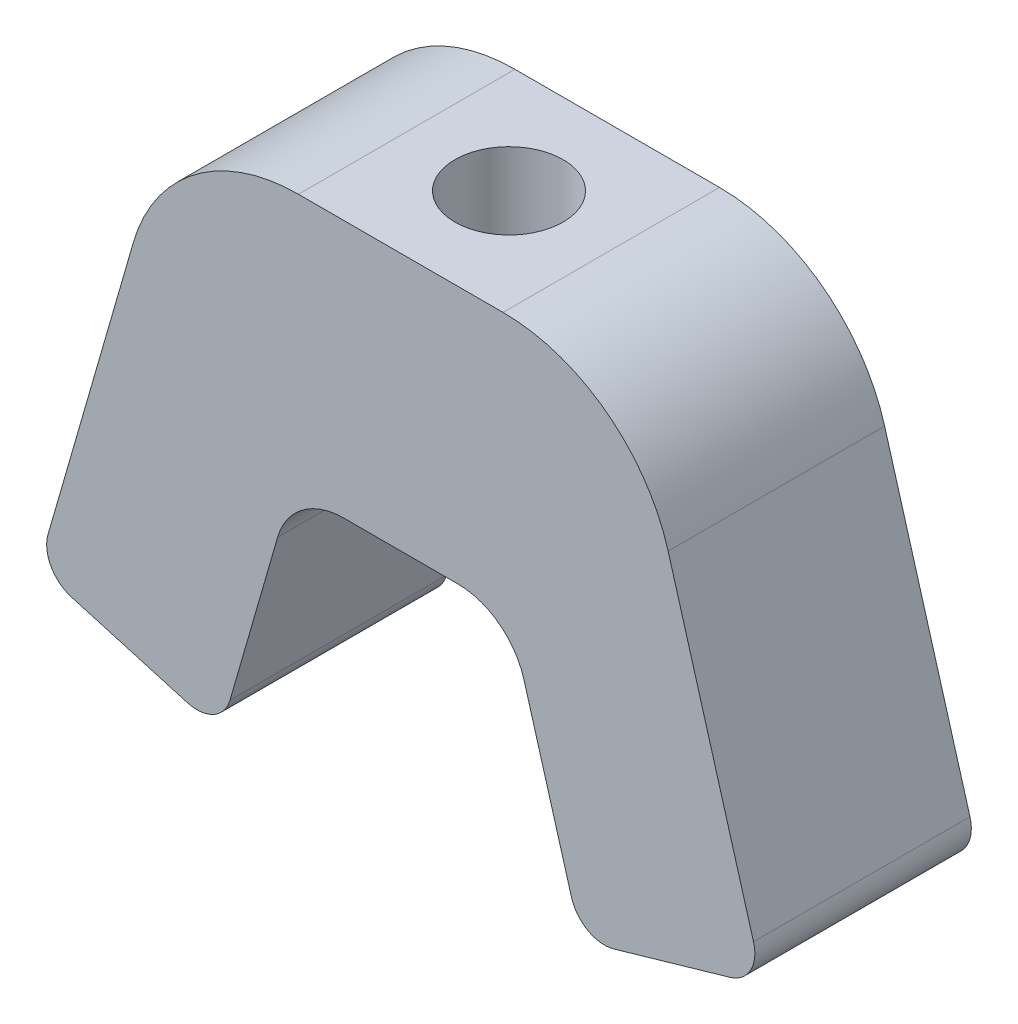
ISO-10303-21;
HEADER;
FILE_DESCRIPTION(('STEP AP214'),'2;1');
FILE_NAME('part.step','',(''),(''),'','','');
FILE_SCHEMA(('AUTOMOTIVE_DESIGN { 1 0 10303 214 1 1 1 1 }'));
ENDSEC;
DATA;
#1=APPLICATION_CONTEXT('core data for automotive mechanical design processes');
#2=APPLICATION_PROTOCOL_DEFINITION('international standard','automotive_design',2000,#1);
#3=PRODUCT_CONTEXT('',#1,'mechanical');
#4=PRODUCT('Part','Part','',(#3));
#5=PRODUCT_RELATED_PRODUCT_CATEGORY('part','',(#4));
#6=PRODUCT_DEFINITION_FORMATION('','',#4);
#7=PRODUCT_DEFINITION_CONTEXT('part definition',#1,'design');
#8=PRODUCT_DEFINITION('design','',#6,#7);
#9=PRODUCT_DEFINITION_SHAPE('','',#8);
#10=(LENGTH_UNIT() NAMED_UNIT(*) SI_UNIT(.MILLI.,.METRE.));
#11=(NAMED_UNIT(*) PLANE_ANGLE_UNIT() SI_UNIT($,.RADIAN.));
#12=(NAMED_UNIT(*) SI_UNIT($,.STERADIAN.) SOLID_ANGLE_UNIT());
#13=UNCERTAINTY_MEASURE_WITH_UNIT(LENGTH_MEASURE(1.E-05),#10,'distance_accuracy_value','');
#14=(GEOMETRIC_REPRESENTATION_CONTEXT(3) GLOBAL_UNCERTAINTY_ASSIGNED_CONTEXT((#13)) GLOBAL_UNIT_ASSIGNED_CONTEXT((#10,
#11,#12)) REPRESENTATION_CONTEXT('',''));
#15=CARTESIAN_POINT('',(0.,0.,0.));
#16=DIRECTION('',(0.,0.,1.));
#17=DIRECTION('',(1.,0.,0.));
#18=AXIS2_PLACEMENT_3D('',#15,#16,#17);
#19=CARTESIAN_POINT('',(-6.66246742722893,-35.6942294275561,8.));
#20=DIRECTION('',(-0.960758995019012,0.277384486750895,0.));
#21=DIRECTION('',(-0.277384486750895,-0.960758995019012,0.));
#22=AXIS2_PLACEMENT_3D('',#19,#20,#21);
#23=PLANE('',#22);
#24=DIRECTION('',(0.277384486750895,0.960758995019012,0.));
#25=VECTOR('',#24,1.);
#26=CARTESIAN_POINT('',(-6.66246742722893,-35.6942294275561,8.));
#27=LINE('',#26,#25);
#28=CARTESIAN_POINT('',(-6.31018912905529,-34.4740655038819,8.));
#29=VERTEX_POINT('',#28);
#30=CARTESIAN_POINT('',(-4.55029823397599,-28.3784434036527,8.));
#31=VERTEX_POINT('',#30);
#32=EDGE_CURVE('E200',#29,#31,#27,.T.);
#33=ORIENTED_EDGE('',*,*,#32,.F.);
#34=DIRECTION('',(0.,0.,-1.));
#35=VECTOR('',#34,1.);
#36=CARTESIAN_POINT('',(-6.31018912905529,-34.4740655038819,8.));
#37=LINE('',#36,#35);
#38=CARTESIAN_POINT('',(-6.31018912905529,-34.4740655038819,0.));
#39=VERTEX_POINT('',#38);
#40=EDGE_CURVE('E304',#29,#39,#37,.T.);
#41=ORIENTED_EDGE('',*,*,#40,.T.);
#42=DIRECTION('',(0.277384486750895,0.960758995019012,0.));
#43=VECTOR('',#42,1.);
#44=CARTESIAN_POINT('',(-6.66246742722893,-35.6942294275561,0.));
#45=LINE('',#44,#43);
#46=CARTESIAN_POINT('',(-4.55029823397599,-28.3784434036527,0.));
#47=VERTEX_POINT('',#46);
#48=EDGE_CURVE('E199',#39,#47,#45,.T.);
#49=ORIENTED_EDGE('',*,*,#48,.T.);
#50=DIRECTION('',(0.,0.,-1.));
#51=VECTOR('',#50,1.);
#52=CARTESIAN_POINT('',(-4.55029823397599,-28.3784434036527,8.));
#53=LINE('',#52,#51);
#54=EDGE_CURVE('E268',#47,#31,#53,.F.);
#55=ORIENTED_EDGE('',*,*,#54,.T.);
#56=EDGE_LOOP('',(#33,#41,#49,#55));
#57=FACE_BOUND('',#56,.T.);
#58=ADVANCED_FACE('F53',(#57),#23,.F.);
#59=CARTESIAN_POINT('',(-4.02038019092665,-26.543,8.));
#60=DIRECTION('',(0.,1.,0.));
#61=DIRECTION('',(0.,0.,1.));
#62=AXIS2_PLACEMENT_3D('',#59,#60,#61);
#63=PLANE('',#62);
#64=CARTESIAN_POINT('',(0.,-26.543,4.));
#65=DIRECTION('',(0.,1.,0.));
#66=DIRECTION('',(0.,0.,1.));
#67=AXIS2_PLACEMENT_3D('',#64,#65,#66);
#68=CIRCLE('',#67,2.);
#69=CARTESIAN_POINT('',(0.,-26.543,6.));
#70=VERTEX_POINT('',#69);
#71=EDGE_CURVE('E196',#70,#70,#68,.T.);
#72=ORIENTED_EDGE('',*,*,#71,.T.);
#73=EDGE_LOOP('',(#72));
#74=FACE_BOUND('',#73,.T.);
#75=DIRECTION('',(1.,0.,0.));
#76=VECTOR('',#75,1.);
#77=CARTESIAN_POINT('',(-4.02038019092665,-26.543,0.));
#78=LINE('',#77,#76);
#79=CARTESIAN_POINT('',(-2.1099703866277,-26.543,0.));
#80=VERTEX_POINT('',#79);
#81=CARTESIAN_POINT('',(2.10997038662771,-26.543,0.));
#82=VERTEX_POINT('',#81);
#83=EDGE_CURVE('E223',#80,#82,#78,.T.);
#84=ORIENTED_EDGE('',*,*,#83,.T.);
#85=DIRECTION('',(0.,0.,-1.));
#86=VECTOR('',#85,1.);
#87=CARTESIAN_POINT('',(2.10997038662771,-26.543,8.));
#88=LINE('',#87,#86);
#89=CARTESIAN_POINT('',(2.10997038662771,-26.543,8.));
#90=VERTEX_POINT('',#89);
#91=EDGE_CURVE('E266',#82,#90,#88,.F.);
#92=ORIENTED_EDGE('',*,*,#91,.T.);
#93=DIRECTION('',(1.,0.,0.));
#94=VECTOR('',#93,1.);
#95=CARTESIAN_POINT('',(-4.02038019092665,-26.543,8.));
#96=LINE('',#95,#94);
#97=CARTESIAN_POINT('',(-2.1099703866277,-26.543,8.));
#98=VERTEX_POINT('',#97);
#99=EDGE_CURVE('E202',#98,#90,#96,.T.);
#100=ORIENTED_EDGE('',*,*,#99,.F.);
#101=DIRECTION('',(0.,0.,-1.));
#102=VECTOR('',#101,1.);
#103=CARTESIAN_POINT('',(-2.1099703866277,-26.543,0.));
#104=LINE('',#103,#102);
#105=EDGE_CURVE('E263',#98,#80,#104,.T.);
#106=ORIENTED_EDGE('',*,*,#105,.T.);
#107=EDGE_LOOP('',(#84,#92,#100,#106));
#108=FACE_BOUND('',#107,.T.);
#109=ADVANCED_FACE('F334',(#74,#108),#63,.F.);
#110=CARTESIAN_POINT('',(4.02038019092666,-26.543,8.));
#111=DIRECTION('',(0.960758995019012,0.277384486750896,0.));
#112=DIRECTION('',(-0.277384486750896,0.960758995019012,0.));
#113=AXIS2_PLACEMENT_3D('',#110,#111,#112);
#114=PLANE('',#113);
#115=DIRECTION('',(0.277384486750896,-0.960758995019012,0.));
#116=VECTOR('',#115,1.);
#117=CARTESIAN_POINT('',(4.02038019092666,-26.543,0.));
#118=LINE('',#117,#116);
#119=CARTESIAN_POINT('',(4.550298233976,-28.3784434036527,0.));
#120=VERTEX_POINT('',#119);
#121=CARTESIAN_POINT('',(6.3101891290553,-34.4740655038819,0.));
#122=VERTEX_POINT('',#121);
#123=EDGE_CURVE('E226',#120,#122,#118,.T.);
#124=ORIENTED_EDGE('',*,*,#123,.T.);
#125=DIRECTION('',(0.,0.,-1.));
#126=VECTOR('',#125,1.);
#127=CARTESIAN_POINT('',(6.3101891290553,-34.4740655038819,8.));
#128=LINE('',#127,#126);
#129=CARTESIAN_POINT('',(6.3101891290553,-34.4740655038819,8.));
#130=VERTEX_POINT('',#129);
#131=EDGE_CURVE('E68',#122,#130,#128,.F.);
#132=ORIENTED_EDGE('',*,*,#131,.T.);
#133=DIRECTION('',(0.277384486750896,-0.960758995019012,0.));
#134=VECTOR('',#133,1.);
#135=CARTESIAN_POINT('',(4.02038019092666,-26.543,8.));
#136=LINE('',#135,#134);
#137=CARTESIAN_POINT('',(4.550298233976,-28.3784434036527,8.));
#138=VERTEX_POINT('',#137);
#139=EDGE_CURVE('E206',#138,#130,#136,.T.);
#140=ORIENTED_EDGE('',*,*,#139,.F.);
#141=DIRECTION('',(0.,0.,-1.));
#142=VECTOR('',#141,1.);
#143=CARTESIAN_POINT('',(4.550298233976,-28.3784434036527,0.));
#144=LINE('',#143,#142);
#145=EDGE_CURVE('E260',#138,#120,#144,.T.);
#146=ORIENTED_EDGE('',*,*,#145,.T.);
#147=EDGE_LOOP('',(#124,#132,#140,#146));
#148=FACE_BOUND('',#147,.T.);
#149=ADVANCED_FACE('F340',(#148),#114,.F.);
#150=CARTESIAN_POINT('',(6.66246742722894,-35.6942294275561,8.));
#151=DIRECTION('',(-0.277384486750897,0.960758995019012,0.));
#152=DIRECTION('',(-0.960758995019012,-0.277384486750897,0.));
#153=AXIS2_PLACEMENT_3D('',#150,#151,#152);
#154=PLANE('',#153);
#155=CARTESIAN_POINT('',(10.0251239097955,-34.723383723928,4.));
#156=DIRECTION('',(0.277384486750897,-0.960758995019012,0.));
#157=DIRECTION('',(0.960758995019012,0.277384486750897,0.));
#158=AXIS2_PLACEMENT_3D('',#155,#156,#157);
#159=CIRCLE('',#158,2.);
#160=CARTESIAN_POINT('',(11.9466418998335,-34.1686147504262,4.));
#161=VERTEX_POINT('',#160);
#162=EDGE_CURVE('E182',#161,#161,#159,.T.);
#163=ORIENTED_EDGE('',*,*,#162,.F.);
#164=EDGE_LOOP('',(#163));
#165=FACE_BOUND('',#164,.T.);
#166=DIRECTION('',(0.960758995019012,0.277384486750897,0.));
#167=VECTOR('',#166,1.);
#168=CARTESIAN_POINT('',(6.66246742722894,-35.6942294275561,0.));
#169=LINE('',#168,#167);
#170=CARTESIAN_POINT('',(7.88263135090309,-35.3419511293825,0.));
#171=VERTEX_POINT('',#170);
#172=CARTESIAN_POINT('',(12.1676164686879,-34.1048163184735,0.));
#173=VERTEX_POINT('',#172);
#174=EDGE_CURVE('E228',#171,#173,#169,.T.);
#175=ORIENTED_EDGE('',*,*,#174,.T.);
#176=DIRECTION('',(0.,0.,-1.));
#177=VECTOR('',#176,1.);
#178=CARTESIAN_POINT('',(12.1676164686879,-34.1048163184735,8.));
#179=LINE('',#178,#177);
#180=CARTESIAN_POINT('',(12.1676164686879,-34.1048163184735,8.));
#181=VERTEX_POINT('',#180);
#182=EDGE_CURVE('E294',#173,#181,#179,.F.);
#183=ORIENTED_EDGE('',*,*,#182,.T.);
#184=DIRECTION('',(0.960758995019012,0.277384486750897,0.));
#185=VECTOR('',#184,1.);
#186=CARTESIAN_POINT('',(6.66246742722894,-35.6942294275561,8.));
#187=LINE('',#186,#185);
#188=CARTESIAN_POINT('',(7.88263135090309,-35.3419511293825,8.));
#189=VERTEX_POINT('',#188);
#190=EDGE_CURVE('E208',#189,#181,#187,.T.);
#191=ORIENTED_EDGE('',*,*,#190,.F.);
#192=DIRECTION('',(0.,0.,-1.));
#193=VECTOR('',#192,1.);
#194=CARTESIAN_POINT('',(7.88263135090309,-35.3419511293825,8.));
#195=LINE('',#194,#193);
#196=EDGE_CURVE('E291',#189,#171,#195,.T.);
#197=ORIENTED_EDGE('',*,*,#196,.T.);
#198=EDGE_LOOP('',(#175,#183,#191,#197));
#199=FACE_BOUND('',#198,.T.);
#200=ADVANCED_FACE('F348',(#165,#199),#154,.F.);
#201=CARTESIAN_POINT('',(13.387780392362,-33.7525380202998,8.));
#202=DIRECTION('',(-0.960758995019012,-0.277384486750896,0.));
#203=DIRECTION('',(0.277384486750896,-0.960758995019012,0.));
#204=AXIS2_PLACEMENT_3D('',#201,#202,#203);
#205=PLANE('',#204);
#206=DIRECTION('',(-0.277384486750896,0.960758995019012,0.));
#207=VECTOR('',#206,1.);
#208=CARTESIAN_POINT('',(13.387780392362,-33.7525380202998,8.));
#209=LINE('',#208,#207);
#210=CARTESIAN_POINT('',(13.0355020941884,-32.5323740966257,8.));
#211=VERTEX_POINT('',#210);
#212=CARTESIAN_POINT('',(9.88108158336339,-21.6066085091318,8.));
#213=VERTEX_POINT('',#212);
#214=EDGE_CURVE('E211',#211,#213,#209,.T.);
#215=ORIENTED_EDGE('',*,*,#214,.F.);
#216=DIRECTION('',(0.,0.,-1.));
#217=VECTOR('',#216,1.);
#218=CARTESIAN_POINT('',(13.0355020941884,-32.5323740966257,8.));
#219=LINE('',#218,#217);
#220=CARTESIAN_POINT('',(13.0355020941884,-32.5323740966257,0.));
#221=VERTEX_POINT('',#220);
#222=EDGE_CURVE('E280',#211,#221,#219,.T.);
#223=ORIENTED_EDGE('',*,*,#222,.T.);
#224=DIRECTION('',(-0.277384486750896,0.960758995019012,0.));
#225=VECTOR('',#224,1.);
#226=CARTESIAN_POINT('',(13.387780392362,-33.7525380202998,0.));
#227=LINE('',#226,#225);
#228=CARTESIAN_POINT('',(9.88108158336339,-21.6066085091318,0.));
#229=VERTEX_POINT('',#228);
#230=EDGE_CURVE('E231',#221,#229,#227,.T.);
#231=ORIENTED_EDGE('',*,*,#230,.T.);
#232=DIRECTION('',(0.,0.,-1.));
#233=VECTOR('',#232,1.);
#234=CARTESIAN_POINT('',(9.88108158336339,-21.6066085091318,8.));
#235=LINE('',#234,#233);
#236=EDGE_CURVE('E257',#229,#213,#235,.F.);
#237=ORIENTED_EDGE('',*,*,#236,.T.);
#238=EDGE_LOOP('',(#215,#223,#231,#237));
#239=FACE_BOUND('',#238,.T.);
#240=ADVANCED_FACE('F356',(#239),#205,.F.);
#241=CARTESIAN_POINT('',(8.55628647574003,-17.018,8.));
#242=DIRECTION('',(0.,-1.,0.));
#243=DIRECTION('',(1.,0.,0.));
#244=AXIS2_PLACEMENT_3D('',#241,#242,#243);
#245=PLANE('',#244);
#246=CARTESIAN_POINT('',(0.,-17.018,4.));
#247=DIRECTION('',(0.,1.,0.));
#248=DIRECTION('',(0.,0.,1.));
#249=AXIS2_PLACEMENT_3D('',#246,#247,#248);
#250=CIRCLE('',#249,2.);
#251=CARTESIAN_POINT('',(0.,-17.018,6.));
#252=VERTEX_POINT('',#251);
#253=EDGE_CURVE('E193',#252,#252,#250,.T.);
#254=ORIENTED_EDGE('',*,*,#253,.F.);
#255=EDGE_LOOP('',(#254));
#256=FACE_BOUND('',#255,.T.);
#257=DIRECTION('',(-1.,0.,0.));
#258=VECTOR('',#257,1.);
#259=CARTESIAN_POINT('',(8.55628647574003,-17.018,0.));
#260=LINE('',#259,#258);
#261=CARTESIAN_POINT('',(3.78026196499266,-17.018,0.));
#262=VERTEX_POINT('',#261);
#263=CARTESIAN_POINT('',(-3.78026196499265,-17.018,0.));
#264=VERTEX_POINT('',#263);
#265=EDGE_CURVE('E233',#262,#264,#260,.T.);
#266=ORIENTED_EDGE('',*,*,#265,.T.);
#267=DIRECTION('',(0.,0.,-1.));
#268=VECTOR('',#267,1.);
#269=CARTESIAN_POINT('',(-3.78026196499265,-17.018,8.));
#270=LINE('',#269,#268);
#271=CARTESIAN_POINT('',(-3.78026196499265,-17.018,8.));
#272=VERTEX_POINT('',#271);
#273=EDGE_CURVE('E251',#264,#272,#270,.F.);
#274=ORIENTED_EDGE('',*,*,#273,.T.);
#275=DIRECTION('',(-1.,0.,0.));
#276=VECTOR('',#275,1.);
#277=CARTESIAN_POINT('',(8.55628647574003,-17.018,8.));
#278=LINE('',#277,#276);
#279=CARTESIAN_POINT('',(3.78026196499266,-17.018,8.));
#280=VERTEX_POINT('',#279);
#281=EDGE_CURVE('E213',#280,#272,#278,.T.);
#282=ORIENTED_EDGE('',*,*,#281,.F.);
#283=DIRECTION('',(0.,0.,-1.));
#284=VECTOR('',#283,1.);
#285=CARTESIAN_POINT('',(3.78026196499266,-17.018,8.));
#286=LINE('',#285,#284);
#287=EDGE_CURVE('E248',#280,#262,#286,.T.);
#288=ORIENTED_EDGE('',*,*,#287,.T.);
#289=EDGE_LOOP('',(#266,#274,#282,#288));
#290=FACE_BOUND('',#289,.T.);
#291=ADVANCED_FACE('F366',(#256,#290),#245,.F.);
#292=CARTESIAN_POINT('',(-8.55628647574002,-17.018,8.));
#293=DIRECTION('',(0.960758995019012,-0.277384486750896,0.));
#294=DIRECTION('',(0.277384486750896,0.960758995019012,0.));
#295=AXIS2_PLACEMENT_3D('',#292,#293,#294);
#296=PLANE('',#295);
#297=DIRECTION('',(-0.277384486750896,-0.960758995019012,0.));
#298=VECTOR('',#297,1.);
#299=CARTESIAN_POINT('',(-8.55628647574002,-17.018,0.));
#300=LINE('',#299,#298);
#301=CARTESIAN_POINT('',(-9.88108158336338,-21.6066085091318,0.));
#302=VERTEX_POINT('',#301);
#303=CARTESIAN_POINT('',(-13.0355020941884,-32.5323740966257,0.));
#304=VERTEX_POINT('',#303);
#305=EDGE_CURVE('E236',#302,#304,#300,.T.);
#306=ORIENTED_EDGE('',*,*,#305,.T.);
#307=DIRECTION('',(0.,0.,-1.));
#308=VECTOR('',#307,1.);
#309=CARTESIAN_POINT('',(-13.0355020941884,-32.5323740966257,8.));
#310=LINE('',#309,#308);
#311=CARTESIAN_POINT('',(-13.0355020941884,-32.5323740966257,8.));
#312=VERTEX_POINT('',#311);
#313=EDGE_CURVE('E11',#304,#312,#310,.F.);
#314=ORIENTED_EDGE('',*,*,#313,.T.);
#315=DIRECTION('',(-0.277384486750896,-0.960758995019012,0.));
#316=VECTOR('',#315,1.);
#317=CARTESIAN_POINT('',(-8.55628647574002,-17.018,8.));
#318=LINE('',#317,#316);
#319=CARTESIAN_POINT('',(-9.88108158336338,-21.6066085091318,8.));
#320=VERTEX_POINT('',#319);
#321=EDGE_CURVE('E216',#320,#312,#318,.T.);
#322=ORIENTED_EDGE('',*,*,#321,.F.);
#323=DIRECTION('',(0.,0.,-1.));
#324=VECTOR('',#323,1.);
#325=CARTESIAN_POINT('',(-9.88108158336338,-21.6066085091318,8.));
#326=LINE('',#325,#324);
#327=EDGE_CURVE('E221',#320,#302,#326,.T.);
#328=ORIENTED_EDGE('',*,*,#327,.T.);
#329=EDGE_LOOP('',(#306,#314,#322,#328));
#330=FACE_BOUND('',#329,.T.);
#331=ADVANCED_FACE('F373',(#330),#296,.F.);
#332=CARTESIAN_POINT('',(-13.387780392362,-33.7525380202998,8.));
#333=DIRECTION('',(0.277384486750896,0.960758995019012,0.));
#334=DIRECTION('',(-0.960758995019012,0.277384486750896,0.));
#335=AXIS2_PLACEMENT_3D('',#332,#333,#334);
#336=PLANE('',#335);
#337=CARTESIAN_POINT('',(-10.0251239097955,-34.723383723928,4.));
#338=DIRECTION('',(-0.277384486750896,-0.960758995019012,0.));
#339=DIRECTION('',(0.960758995019012,-0.277384486750896,0.));
#340=AXIS2_PLACEMENT_3D('',#337,#338,#339);
#341=CIRCLE('',#340,2.);
#342=CARTESIAN_POINT('',(-8.10360591975745,-35.2781526974298,4.));
#343=VERTEX_POINT('',#342);
#344=EDGE_CURVE('E183',#343,#343,#341,.T.);
#345=ORIENTED_EDGE('',*,*,#344,.F.);
#346=EDGE_LOOP('',(#345));
#347=FACE_BOUND('',#346,.T.);
#348=DIRECTION('',(0.960758995019012,-0.277384486750896,0.));
#349=VECTOR('',#348,1.);
#350=CARTESIAN_POINT('',(-13.387780392362,-33.7525380202998,0.));
#351=LINE('',#350,#349);
#352=CARTESIAN_POINT('',(-12.1676164686879,-34.1048163184735,0.));
#353=VERTEX_POINT('',#352);
#354=CARTESIAN_POINT('',(-7.88263135090307,-35.3419511293825,0.));
#355=VERTEX_POINT('',#354);
#356=EDGE_CURVE('E203',#353,#355,#351,.T.);
#357=ORIENTED_EDGE('',*,*,#356,.T.);
#358=DIRECTION('',(0.,0.,-1.));
#359=VECTOR('',#358,1.);
#360=CARTESIAN_POINT('',(-7.88263135090307,-35.3419511293825,8.));
#361=LINE('',#360,#359);
#362=CARTESIAN_POINT('',(-7.88263135090307,-35.3419511293825,8.));
#363=VERTEX_POINT('',#362);
#364=EDGE_CURVE('E61',#355,#363,#361,.F.);
#365=ORIENTED_EDGE('',*,*,#364,.T.);
#366=DIRECTION('',(0.960758995019012,-0.277384486750896,0.));
#367=VECTOR('',#366,1.);
#368=CARTESIAN_POINT('',(-13.387780392362,-33.7525380202998,8.));
#369=LINE('',#368,#367);
#370=CARTESIAN_POINT('',(-12.1676164686879,-34.1048163184735,8.));
#371=VERTEX_POINT('',#370);
#372=EDGE_CURVE('E219',#371,#363,#369,.T.);
#373=ORIENTED_EDGE('',*,*,#372,.F.);
#374=DIRECTION('',(0.,0.,-1.));
#375=VECTOR('',#374,1.);
#376=CARTESIAN_POINT('',(-12.1676164686879,-34.1048163184735,8.));
#377=LINE('',#376,#375);
#378=EDGE_CURVE('E307',#371,#353,#377,.T.);
#379=ORIENTED_EDGE('',*,*,#378,.T.);
#380=EDGE_LOOP('',(#357,#365,#373,#379));
#381=FACE_BOUND('',#380,.T.);
#382=ADVANCED_FACE('F312',(#347,#381),#336,.F.);
#383=CARTESIAN_POINT('',(0.,0.,8.));
#384=DIRECTION('',(0.,0.,-1.));
#385=DIRECTION('',(-1.,0.,0.));
#386=AXIS2_PLACEMENT_3D('',#383,#384,#385);
#387=PLANE('',#386);
#388=ORIENTED_EDGE('',*,*,#190,.T.);
#389=CARTESIAN_POINT('',(11.8153381705142,-32.8846523947993,8.));
#390=DIRECTION('',(0.,0.,-1.));
#391=DIRECTION('',(-1.,0.,0.));
#392=AXIS2_PLACEMENT_3D('',#389,#390,#391);
#393=CIRCLE('',#392,1.27);
#394=EDGE_CURVE('E301',#181,#211,#393,.F.);
#395=ORIENTED_EDGE('',*,*,#394,.T.);
#396=ORIENTED_EDGE('',*,*,#214,.T.);
#397=CARTESIAN_POINT('',(3.78026196499266,-23.368,8.));
#398=DIRECTION('',(0.,0.,-1.));
#399=DIRECTION('',(-1.,0.,0.));
#400=AXIS2_PLACEMENT_3D('',#397,#398,#399);
#401=CIRCLE('',#400,6.35);
#402=EDGE_CURVE('E253',#213,#280,#401,.F.);
#403=ORIENTED_EDGE('',*,*,#402,.T.);
#404=ORIENTED_EDGE('',*,*,#281,.T.);
#405=CARTESIAN_POINT('',(-3.78026196499265,-23.368,8.));
#406=DIRECTION('',(0.,0.,-1.));
#407=DIRECTION('',(-1.,0.,0.));
#408=AXIS2_PLACEMENT_3D('',#405,#406,#407);
#409=CIRCLE('',#408,6.35);
#410=EDGE_CURVE('E255',#272,#320,#409,.F.);
#411=ORIENTED_EDGE('',*,*,#410,.T.);
#412=ORIENTED_EDGE('',*,*,#321,.T.);
#413=CARTESIAN_POINT('',(-11.8153381705142,-32.8846523947993,8.));
#414=DIRECTION('',(0.,0.,-1.));
#415=DIRECTION('',(-1.,0.,0.));
#416=AXIS2_PLACEMENT_3D('',#413,#414,#415);
#417=CIRCLE('',#416,1.27);
#418=EDGE_CURVE('E296',#312,#371,#417,.F.);
#419=ORIENTED_EDGE('',*,*,#418,.T.);
#420=ORIENTED_EDGE('',*,*,#372,.T.);
#421=CARTESIAN_POINT('',(-7.53035305272943,-34.1217872057083,8.));
#422=DIRECTION('',(0.,0.,-1.));
#423=DIRECTION('',(-1.,0.,0.));
#424=AXIS2_PLACEMENT_3D('',#421,#422,#423);
#425=CIRCLE('',#424,1.27);
#426=EDGE_CURVE('E76',#363,#29,#425,.F.);
#427=ORIENTED_EDGE('',*,*,#426,.T.);
#428=ORIENTED_EDGE('',*,*,#32,.T.);
#429=CARTESIAN_POINT('',(-2.1099703866277,-29.083,8.));
#430=DIRECTION('',(0.,0.,-1.));
#431=DIRECTION('',(-1.,0.,0.));
#432=AXIS2_PLACEMENT_3D('',#429,#430,#431);
#433=CIRCLE('',#432,2.54);
#434=EDGE_CURVE('E278',#31,#98,#433,.T.);
#435=ORIENTED_EDGE('',*,*,#434,.T.);
#436=ORIENTED_EDGE('',*,*,#99,.T.);
#437=CARTESIAN_POINT('',(2.10997038662771,-29.083,8.));
#438=DIRECTION('',(0.,0.,-1.));
#439=DIRECTION('',(-1.,0.,0.));
#440=AXIS2_PLACEMENT_3D('',#437,#438,#439);
#441=CIRCLE('',#440,2.54);
#442=EDGE_CURVE('E273',#90,#138,#441,.T.);
#443=ORIENTED_EDGE('',*,*,#442,.T.);
#444=ORIENTED_EDGE('',*,*,#139,.T.);
#445=CARTESIAN_POINT('',(7.53035305272945,-34.1217872057083,8.));
#446=DIRECTION('',(0.,0.,-1.));
#447=DIRECTION('',(-1.,0.,0.));
#448=AXIS2_PLACEMENT_3D('',#445,#446,#447);
#449=CIRCLE('',#448,1.27);
#450=EDGE_CURVE('E299',#130,#189,#449,.F.);
#451=ORIENTED_EDGE('',*,*,#450,.T.);
#452=EDGE_LOOP('',(#388,#395,#396,#403,#404,#411,#412,#419,#420,#427,#428,#435,#436,#443,#444,#451));
#453=FACE_BOUND('',#452,.T.);
#454=ADVANCED_FACE('F316',(#453),#387,.F.);
#455=CARTESIAN_POINT('',(0.,0.,0.));
#456=DIRECTION('',(0.,0.,-1.));
#457=DIRECTION('',(-1.,0.,0.));
#458=AXIS2_PLACEMENT_3D('',#455,#456,#457);
#459=PLANE('',#458);
#460=ORIENTED_EDGE('',*,*,#230,.F.);
#461=CARTESIAN_POINT('',(11.8153381705142,-32.8846523947993,0.));
#462=DIRECTION('',(0.,0.,-1.));
#463=DIRECTION('',(-1.,0.,0.));
#464=AXIS2_PLACEMENT_3D('',#461,#462,#463);
#465=CIRCLE('',#464,1.27);
#466=EDGE_CURVE('E289',#221,#173,#465,.T.);
#467=ORIENTED_EDGE('',*,*,#466,.T.);
#468=ORIENTED_EDGE('',*,*,#174,.F.);
#469=CARTESIAN_POINT('',(7.53035305272945,-34.1217872057083,0.));
#470=DIRECTION('',(0.,0.,-1.));
#471=DIRECTION('',(-1.,0.,0.));
#472=AXIS2_PLACEMENT_3D('',#469,#470,#471);
#473=CIRCLE('',#472,1.27);
#474=EDGE_CURVE('E287',#171,#122,#473,.T.);
#475=ORIENTED_EDGE('',*,*,#474,.T.);
#476=ORIENTED_EDGE('',*,*,#123,.F.);
#477=CARTESIAN_POINT('',(2.10997038662771,-29.083,0.));
#478=DIRECTION('',(0.,0.,-1.));
#479=DIRECTION('',(-1.,0.,0.));
#480=AXIS2_PLACEMENT_3D('',#477,#478,#479);
#481=CIRCLE('',#480,2.54);
#482=EDGE_CURVE('E271',#120,#82,#481,.F.);
#483=ORIENTED_EDGE('',*,*,#482,.T.);
#484=ORIENTED_EDGE('',*,*,#83,.F.);
#485=CARTESIAN_POINT('',(-2.1099703866277,-29.083,0.));
#486=DIRECTION('',(0.,0.,-1.));
#487=DIRECTION('',(-1.,0.,0.));
#488=AXIS2_PLACEMENT_3D('',#485,#486,#487);
#489=CIRCLE('',#488,2.54);
#490=EDGE_CURVE('E275',#80,#47,#489,.F.);
#491=ORIENTED_EDGE('',*,*,#490,.T.);
#492=ORIENTED_EDGE('',*,*,#48,.F.);
#493=CARTESIAN_POINT('',(-7.53035305272943,-34.1217872057083,0.));
#494=DIRECTION('',(0.,0.,-1.));
#495=DIRECTION('',(-1.,0.,0.));
#496=AXIS2_PLACEMENT_3D('',#493,#494,#495);
#497=CIRCLE('',#496,1.27);
#498=EDGE_CURVE('E285',#39,#355,#497,.T.);
#499=ORIENTED_EDGE('',*,*,#498,.T.);
#500=ORIENTED_EDGE('',*,*,#356,.F.);
#501=CARTESIAN_POINT('',(-11.8153381705142,-32.8846523947993,0.));
#502=DIRECTION('',(0.,0.,-1.));
#503=DIRECTION('',(-1.,0.,0.));
#504=AXIS2_PLACEMENT_3D('',#501,#502,#503);
#505=CIRCLE('',#504,1.27);
#506=EDGE_CURVE('E283',#353,#304,#505,.T.);
#507=ORIENTED_EDGE('',*,*,#506,.T.);
#508=ORIENTED_EDGE('',*,*,#305,.F.);
#509=CARTESIAN_POINT('',(-3.78026196499265,-23.368,0.));
#510=DIRECTION('',(0.,0.,-1.));
#511=DIRECTION('',(-1.,0.,0.));
#512=AXIS2_PLACEMENT_3D('',#509,#510,#511);
#513=CIRCLE('',#512,6.35);
#514=EDGE_CURVE('E246',#302,#264,#513,.T.);
#515=ORIENTED_EDGE('',*,*,#514,.T.);
#516=ORIENTED_EDGE('',*,*,#265,.F.);
#517=CARTESIAN_POINT('',(3.78026196499266,-23.368,0.));
#518=DIRECTION('',(0.,0.,-1.));
#519=DIRECTION('',(-1.,0.,0.));
#520=AXIS2_PLACEMENT_3D('',#517,#518,#519);
#521=CIRCLE('',#520,6.35);
#522=EDGE_CURVE('E243',#262,#229,#521,.T.);
#523=ORIENTED_EDGE('',*,*,#522,.T.);
#524=EDGE_LOOP('',(#460,#467,#468,#475,#476,#483,#484,#491,#492,#499,#500,#507,#508,#515,#516,#523));
#525=FACE_BOUND('',#524,.T.);
#526=ADVANCED_FACE('F324',(#525),#459,.T.);
#527=CARTESIAN_POINT('',(-3.78026196499265,-23.368,8.));
#528=DIRECTION('',(0.,0.,-1.));
#529=DIRECTION('',(-1.,0.,0.));
#530=AXIS2_PLACEMENT_3D('',#527,#528,#529);
#531=CYLINDRICAL_SURFACE('',#530,6.35);
#532=ORIENTED_EDGE('',*,*,#410,.F.);
#533=ORIENTED_EDGE('',*,*,#273,.F.);
#534=ORIENTED_EDGE('',*,*,#514,.F.);
#535=ORIENTED_EDGE('',*,*,#327,.F.);
#536=EDGE_LOOP('',(#532,#533,#534,#535));
#537=FACE_BOUND('',#536,.T.);
#538=ADVANCED_FACE('F369',(#537),#531,.T.);
#539=CARTESIAN_POINT('',(3.78026196499266,-23.368,8.));
#540=DIRECTION('',(0.,0.,-1.));
#541=DIRECTION('',(-1.,0.,0.));
#542=AXIS2_PLACEMENT_3D('',#539,#540,#541);
#543=CYLINDRICAL_SURFACE('',#542,6.35);
#544=ORIENTED_EDGE('',*,*,#402,.F.);
#545=ORIENTED_EDGE('',*,*,#236,.F.);
#546=ORIENTED_EDGE('',*,*,#522,.F.);
#547=ORIENTED_EDGE('',*,*,#287,.F.);
#548=EDGE_LOOP('',(#544,#545,#546,#547));
#549=FACE_BOUND('',#548,.T.);
#550=ADVANCED_FACE('F362',(#549),#543,.T.);
#551=CARTESIAN_POINT('',(2.10997038662771,-29.083,8.));
#552=DIRECTION('',(0.,0.,1.));
#553=DIRECTION('',(1.,0.,0.));
#554=AXIS2_PLACEMENT_3D('',#551,#552,#553);
#555=CYLINDRICAL_SURFACE('',#554,2.54);
#556=ORIENTED_EDGE('',*,*,#442,.F.);
#557=ORIENTED_EDGE('',*,*,#91,.F.);
#558=ORIENTED_EDGE('',*,*,#482,.F.);
#559=ORIENTED_EDGE('',*,*,#145,.F.);
#560=EDGE_LOOP('',(#556,#557,#558,#559));
#561=FACE_BOUND('',#560,.T.);
#562=ADVANCED_FACE('F337',(#561),#555,.F.);
#563=CARTESIAN_POINT('',(-2.1099703866277,-29.083,8.));
#564=DIRECTION('',(0.,0.,1.));
#565=DIRECTION('',(1.,0.,0.));
#566=AXIS2_PLACEMENT_3D('',#563,#564,#565);
#567=CYLINDRICAL_SURFACE('',#566,2.54);
#568=ORIENTED_EDGE('',*,*,#434,.F.);
#569=ORIENTED_EDGE('',*,*,#54,.F.);
#570=ORIENTED_EDGE('',*,*,#490,.F.);
#571=ORIENTED_EDGE('',*,*,#105,.F.);
#572=EDGE_LOOP('',(#568,#569,#570,#571));
#573=FACE_BOUND('',#572,.T.);
#574=ADVANCED_FACE('F330',(#573),#567,.F.);
#575=CARTESIAN_POINT('',(11.8153381705142,-32.8846523947993,8.));
#576=DIRECTION('',(0.,0.,-1.));
#577=DIRECTION('',(-1.,0.,0.));
#578=AXIS2_PLACEMENT_3D('',#575,#576,#577);
#579=CYLINDRICAL_SURFACE('',#578,1.27);
#580=ORIENTED_EDGE('',*,*,#394,.F.);
#581=ORIENTED_EDGE('',*,*,#182,.F.);
#582=ORIENTED_EDGE('',*,*,#466,.F.);
#583=ORIENTED_EDGE('',*,*,#222,.F.);
#584=EDGE_LOOP('',(#580,#581,#582,#583));
#585=FACE_BOUND('',#584,.T.);
#586=ADVANCED_FACE('F354',(#585),#579,.T.);
#587=CARTESIAN_POINT('',(7.53035305272945,-34.1217872057083,8.));
#588=DIRECTION('',(0.,0.,-1.));
#589=DIRECTION('',(-1.,0.,0.));
#590=AXIS2_PLACEMENT_3D('',#587,#588,#589);
#591=CYLINDRICAL_SURFACE('',#590,1.27);
#592=ORIENTED_EDGE('',*,*,#450,.F.);
#593=ORIENTED_EDGE('',*,*,#131,.F.);
#594=ORIENTED_EDGE('',*,*,#474,.F.);
#595=ORIENTED_EDGE('',*,*,#196,.F.);
#596=EDGE_LOOP('',(#592,#593,#594,#595));
#597=FACE_BOUND('',#596,.T.);
#598=ADVANCED_FACE('F345',(#597),#591,.T.);
#599=CARTESIAN_POINT('',(-7.53035305272943,-34.1217872057083,8.));
#600=DIRECTION('',(0.,0.,-1.));
#601=DIRECTION('',(-1.,0.,0.));
#602=AXIS2_PLACEMENT_3D('',#599,#600,#601);
#603=CYLINDRICAL_SURFACE('',#602,1.27);
#604=ORIENTED_EDGE('',*,*,#426,.F.);
#605=ORIENTED_EDGE('',*,*,#364,.F.);
#606=ORIENTED_EDGE('',*,*,#498,.F.);
#607=ORIENTED_EDGE('',*,*,#40,.F.);
#608=EDGE_LOOP('',(#604,#605,#606,#607));
#609=FACE_BOUND('',#608,.T.);
#610=ADVANCED_FACE('F319',(#609),#603,.T.);
#611=CARTESIAN_POINT('',(-11.8153381705142,-32.8846523947993,8.));
#612=DIRECTION('',(0.,0.,-1.));
#613=DIRECTION('',(-1.,0.,0.));
#614=AXIS2_PLACEMENT_3D('',#611,#612,#613);
#615=CYLINDRICAL_SURFACE('',#614,1.27);
#616=ORIENTED_EDGE('',*,*,#418,.F.);
#617=ORIENTED_EDGE('',*,*,#313,.F.);
#618=ORIENTED_EDGE('',*,*,#506,.F.);
#619=ORIENTED_EDGE('',*,*,#378,.F.);
#620=EDGE_LOOP('',(#616,#617,#618,#619));
#621=FACE_BOUND('',#620,.T.);
#622=ADVANCED_FACE('F55',(#621),#615,.T.);
#623=CARTESIAN_POINT('',(0.,-17.018,4.));
#624=DIRECTION('',(0.,1.,0.));
#625=DIRECTION('',(0.,0.,1.));
#626=AXIS2_PLACEMENT_3D('',#623,#624,#625);
#627=CYLINDRICAL_SURFACE('',#626,2.);
#628=ORIENTED_EDGE('',*,*,#253,.T.);
#629=EDGE_LOOP('',(#628));
#630=FACE_BOUND('',#629,.T.);
#631=ORIENTED_EDGE('',*,*,#71,.F.);
#632=EDGE_LOOP('',(#631));
#633=FACE_BOUND('',#632,.T.);
#634=ADVANCED_FACE('F378',(#630,#633),#627,.F.);
#635=CARTESIAN_POINT('',(7.05471329959536,-24.4349615195076,4.));
#636=DIRECTION('',(0.277384486750897,-0.960758995019012,0.));
#637=DIRECTION('',(0.960758995019012,0.277384486750897,0.));
#638=AXIS2_PLACEMENT_3D('',#635,#636,#637);
#639=CONICAL_SURFACE('',#638,2.,1.02974425867665);
#640=CARTESIAN_POINT('',(6.72137447075979,-23.2803970305407,4.));
#641=VERTEX_POINT('',#640);
#642=VERTEX_LOOP('',#641);
#643=FACE_BOUND('',#642,.T.);
#644=CARTESIAN_POINT('',(7.05471329959536,-24.4349615195076,4.));
#645=DIRECTION('',(0.277384486750897,-0.960758995019012,0.));
#646=DIRECTION('',(0.960758995019012,0.277384486750897,0.));
#647=AXIS2_PLACEMENT_3D('',#644,#645,#646);
#648=CIRCLE('',#647,2.);
#649=CARTESIAN_POINT('',(8.97623128963338,-23.8801925460058,4.));
#650=VERTEX_POINT('',#649);
#651=EDGE_CURVE('E186',#650,#650,#648,.T.);
#652=ORIENTED_EDGE('',*,*,#651,.T.);
#653=EDGE_LOOP('',(#652));
#654=FACE_BOUND('',#653,.T.);
#655=ADVANCED_FACE('F384',(#643,#654),#639,.F.);
#656=CARTESIAN_POINT('',(10.0251239097955,-34.723383723928,4.));
#657=DIRECTION('',(0.277384486750897,-0.960758995019012,0.));
#658=DIRECTION('',(0.960758995019012,0.277384486750897,0.));
#659=AXIS2_PLACEMENT_3D('',#656,#657,#658);
#660=CYLINDRICAL_SURFACE('',#659,2.);
#661=ORIENTED_EDGE('',*,*,#651,.F.);
#662=EDGE_LOOP('',(#661));
#663=FACE_BOUND('',#662,.T.);
#664=ORIENTED_EDGE('',*,*,#162,.T.);
#665=EDGE_LOOP('',(#664));
#666=FACE_BOUND('',#665,.T.);
#667=ADVANCED_FACE('F176',(#663,#666),#660,.F.);
#668=CARTESIAN_POINT('',(-7.05471329959535,-24.4349615195076,4.));
#669=DIRECTION('',(-0.277384486750896,-0.960758995019012,0.));
#670=DIRECTION('',(0.960758995019012,-0.277384486750896,0.));
#671=AXIS2_PLACEMENT_3D('',#668,#669,#670);
#672=CONICAL_SURFACE('',#671,2.,1.02974425867666);
#673=CARTESIAN_POINT('',(-6.72137447075978,-23.2803970305407,4.));
#674=VERTEX_POINT('',#673);
#675=VERTEX_LOOP('',#674);
#676=FACE_BOUND('',#675,.T.);
#677=CARTESIAN_POINT('',(-7.05471329959535,-24.4349615195076,4.));
#678=DIRECTION('',(-0.277384486750896,-0.960758995019012,0.));
#679=DIRECTION('',(0.960758995019012,-0.277384486750896,0.));
#680=AXIS2_PLACEMENT_3D('',#677,#678,#679);
#681=CIRCLE('',#680,2.);
#682=CARTESIAN_POINT('',(-5.13319530955733,-24.9897304930094,4.));
#683=VERTEX_POINT('',#682);
#684=EDGE_CURVE('E180',#683,#683,#681,.T.);
#685=ORIENTED_EDGE('',*,*,#684,.T.);
#686=EDGE_LOOP('',(#685));
#687=FACE_BOUND('',#686,.T.);
#688=ADVANCED_FACE('F172',(#676,#687),#672,.F.);
#689=CARTESIAN_POINT('',(-10.0251239097955,-34.723383723928,4.));
#690=DIRECTION('',(-0.277384486750896,-0.960758995019012,0.));
#691=DIRECTION('',(0.960758995019012,-0.277384486750896,0.));
#692=AXIS2_PLACEMENT_3D('',#689,#690,#691);
#693=CYLINDRICAL_SURFACE('',#692,2.);
#694=CARTESIAN_POINT('',(-5.13319530955733,-24.9897304930094,4.));
#695=CARTESIAN_POINT('',(-5.16413708674692,-25.0969015576387,4.));
#696=CARTESIAN_POINT('',(-5.1950788639365,-25.2040726222681,4.));
#697=CARTESIAN_POINT('',(-5.25696241831567,-25.4184147515269,4.));
#698=CARTESIAN_POINT('',(-5.28790419550525,-25.5255858161563,4.));
#699=CARTESIAN_POINT('',(-5.34978774988442,-25.739927945415,4.));
#700=CARTESIAN_POINT('',(-5.38072952707401,-25.8470990100444,4.));
#701=CARTESIAN_POINT('',(-5.44261308145318,-26.0614411393031,4.));
#702=CARTESIAN_POINT('',(-5.47355485864276,-26.1686122039325,4.));
#703=CARTESIAN_POINT('',(-5.53543841302193,-26.3829543331913,4.));
#704=CARTESIAN_POINT('',(-5.56638019021151,-26.4901253978207,4.));
#705=CARTESIAN_POINT('',(-5.62826374459068,-26.7044675270794,4.));
#706=CARTESIAN_POINT('',(-5.65920552178027,-26.8116385917088,4.));
#707=CARTESIAN_POINT('',(-5.72108907615944,-27.0259807209676,4.));
#708=CARTESIAN_POINT('',(-5.75203085334902,-27.1331517855969,4.));
#709=CARTESIAN_POINT('',(-5.81391440772819,-27.3474939148557,4.));
#710=CARTESIAN_POINT('',(-5.84485618491777,-27.4546649794851,4.));
#711=CARTESIAN_POINT('',(-5.90673973929694,-27.6690071087438,4.));
#712=CARTESIAN_POINT('',(-5.93768151648653,-27.7761781733732,4.));
#713=CARTESIAN_POINT('',(-5.9995650708657,-27.990520302632,4.));
#714=CARTESIAN_POINT('',(-6.03050684805528,-28.0976913672614,4.));
#715=CARTESIAN_POINT('',(-6.09239040243445,-28.3120334965201,4.));
#716=CARTESIAN_POINT('',(-6.12333217962404,-28.4192045611495,4.));
#717=CARTESIAN_POINT('',(-6.18521573400321,-28.6335466904083,4.));
#718=CARTESIAN_POINT('',(-6.21615751119279,-28.7407177550376,4.));
#719=CARTESIAN_POINT('',(-6.27804106557196,-28.9550598842964,4.));
#720=CARTESIAN_POINT('',(-6.30898284276154,-29.0622309489258,4.));
#721=CARTESIAN_POINT('',(-6.37086639714071,-29.2765730781845,4.));
#722=CARTESIAN_POINT('',(-6.4018081743303,-29.3837441428139,4.));
#723=CARTESIAN_POINT('',(-6.46369172870947,-29.5980862720727,4.));
#724=CARTESIAN_POINT('',(-6.49463350589905,-29.705257336702,4.));
#725=CARTESIAN_POINT('',(-6.55651706027822,-29.9195994659608,4.));
#726=CARTESIAN_POINT('',(-6.5874588374678,-30.0267705305902,4.));
#727=CARTESIAN_POINT('',(-6.64934239184697,-30.2411126598489,4.));
#728=CARTESIAN_POINT('',(-6.68028416903656,-30.3482837244783,4.));
#729=CARTESIAN_POINT('',(-6.74216772341573,-30.5626258537371,4.));
#730=CARTESIAN_POINT('',(-6.77310950060531,-30.6697969183665,4.));
#731=CARTESIAN_POINT('',(-6.83499305498448,-30.8841390476252,4.));
#732=CARTESIAN_POINT('',(-6.86593483217407,-30.9913101122546,4.));
#733=CARTESIAN_POINT('',(-6.92781838655324,-31.2056522415133,4.));
#734=CARTESIAN_POINT('',(-6.95876016374282,-31.3128233061427,4.));
#735=CARTESIAN_POINT('',(-7.02064371812199,-31.5271654354015,4.));
#736=CARTESIAN_POINT('',(-7.05158549531157,-31.6343365000309,4.));
#737=CARTESIAN_POINT('',(-7.11346904969074,-31.8486786292896,4.));
#738=CARTESIAN_POINT('',(-7.14441082688033,-31.955849693919,4.));
#739=CARTESIAN_POINT('',(-7.2062943812595,-32.1701918231778,4.));
#740=CARTESIAN_POINT('',(-7.23723615844908,-32.2773628878071,4.));
#741=CARTESIAN_POINT('',(-7.29911971282825,-32.4917050170659,4.));
#742=CARTESIAN_POINT('',(-7.33006149001783,-32.5988760816953,4.));
#743=CARTESIAN_POINT('',(-7.391945044397,-32.813218210954,4.));
#744=CARTESIAN_POINT('',(-7.42288682158659,-32.9203892755834,4.));
#745=CARTESIAN_POINT('',(-7.48477037596576,-33.1347314048422,4.));
#746=CARTESIAN_POINT('',(-7.51571215315534,-33.2419024694715,4.));
#747=CARTESIAN_POINT('',(-7.57759570753451,-33.4562445987303,4.));
#748=CARTESIAN_POINT('',(-7.6085374847241,-33.5634156633597,4.));
#749=CARTESIAN_POINT('',(-7.67042103910326,-33.7777577926185,4.));
#750=CARTESIAN_POINT('',(-7.70136281629285,-33.8849288572478,4.));
#751=CARTESIAN_POINT('',(-7.76324637067202,-34.0992709865066,4.));
#752=CARTESIAN_POINT('',(-7.7941881478616,-34.206442051136,4.));
#753=CARTESIAN_POINT('',(-7.85607170224077,-34.4207841803947,4.));
#754=CARTESIAN_POINT('',(-7.88701347943036,-34.5279552450241,4.));
#755=CARTESIAN_POINT('',(-7.94889703380953,-34.7422973742829,4.));
#756=CARTESIAN_POINT('',(-7.97983881099911,-34.8494684389122,4.));
#757=CARTESIAN_POINT('',(-8.04172236537828,-35.063810568171,4.));
#758=CARTESIAN_POINT('',(-8.07266414256786,-35.1709816328004,4.));
#759=CARTESIAN_POINT('',(-8.10360591975745,-35.2781526974298,4.));
#760=B_SPLINE_CURVE_WITH_KNOTS('',3,(#694,#695,#696,#697,#698,#699,#700,#701,#702,#703,#704,
#705,#706,#707,#708,#709,#710,#711,#712,#713,#714,#715,#716,#717,#718,#719,#720,#721,#722,#723,
#724,#725,#726,#727,#728,#729,#730,#731,#732,#733,#734,#735,#736,#737,#738,#739,#740,#741,#742,
#743,#744,#745,#746,#747,#748,#749,#750,#751,#752,#753,#754,#755,#756,#757,#758,#759),
.UNSPECIFIED.,.F.,.F.,(4,2,2,2,2,2,2,2,2,2,2,2,2,2,2,2,2,2,2,2,2,2,2,2,2,2,2,2,2,2,2,2,4),(0.,
0.334645,0.66929,1.003935,1.33858,1.673225,2.00787,2.342515,2.67716,3.011805,3.34645,
3.68109500000001,4.01574000000001,4.350385,4.68503,5.019675,5.35432,5.688965,6.02361,6.358255,
6.6929,7.027545,7.36219,7.696835,8.03148,8.366125,8.70077,9.035415,9.37006,9.704705,10.03935,
10.373995,10.70864),.UNSPECIFIED.);
#761=EDGE_CURVE('BSEAM175',#683,#343,#760,.T.);
#762=ORIENTED_EDGE('',*,*,#684,.F.);
#763=ORIENTED_EDGE('',*,*,#344,.T.);
#764=ORIENTED_EDGE('',*,*,#761,.T.);
#765=ORIENTED_EDGE('',*,*,#761,.F.);
#766=EDGE_LOOP('',(#762,#764,#763,#765));
#767=FACE_BOUND('',#766,.T.);
#768=ADVANCED_FACE('F175',(#767),#693,.F.);
#769=CLOSED_SHELL('',(#58,#109,#149,#200,#240,#291,#331,#382,#454,#526,#538,#550,#562,#574,#586,
#598,#610,#622,#634,#655,#667,#688,#768));
#770=MANIFOLD_SOLID_BREP('B2',#769);
#771=ADVANCED_BREP_SHAPE_REPRESENTATION('',(#18,#770),#14);
#772=SHAPE_DEFINITION_REPRESENTATION(#9,#771);
ENDSEC;
END-ISO-10303-21;
